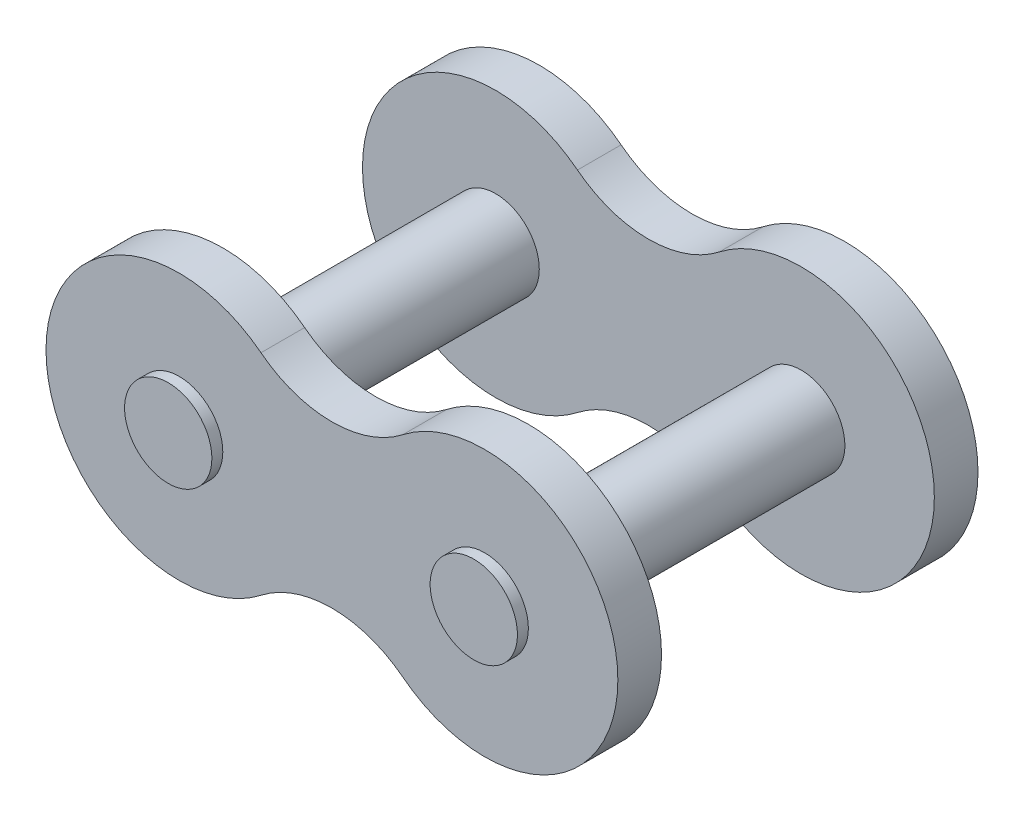
ISO-10303-21;
HEADER;
FILE_DESCRIPTION(('STEP AP214'),'2;1');
FILE_NAME('part.step','',(''),(''),'','','');
FILE_SCHEMA(('AUTOMOTIVE_DESIGN { 1 0 10303 214 1 1 1 1 }'));
ENDSEC;
DATA;
#1=APPLICATION_CONTEXT('core data for automotive mechanical design processes');
#2=APPLICATION_PROTOCOL_DEFINITION('international standard','automotive_design',2000,#1);
#3=PRODUCT_CONTEXT('',#1,'mechanical');
#4=PRODUCT('Part','Part','',(#3));
#5=PRODUCT_RELATED_PRODUCT_CATEGORY('part','',(#4));
#6=PRODUCT_DEFINITION_FORMATION('','',#4);
#7=PRODUCT_DEFINITION_CONTEXT('part definition',#1,'design');
#8=PRODUCT_DEFINITION('design','',#6,#7);
#9=PRODUCT_DEFINITION_SHAPE('','',#8);
#10=(LENGTH_UNIT() NAMED_UNIT(*) SI_UNIT(.MILLI.,.METRE.));
#11=(NAMED_UNIT(*) PLANE_ANGLE_UNIT() SI_UNIT($,.RADIAN.));
#12=(NAMED_UNIT(*) SI_UNIT($,.STERADIAN.) SOLID_ANGLE_UNIT());
#13=UNCERTAINTY_MEASURE_WITH_UNIT(LENGTH_MEASURE(1.E-05),#10,'distance_accuracy_value','');
#14=(GEOMETRIC_REPRESENTATION_CONTEXT(3) GLOBAL_UNCERTAINTY_ASSIGNED_CONTEXT((#13)) GLOBAL_UNIT_ASSIGNED_CONTEXT((#10,
#11,#12)) REPRESENTATION_CONTEXT('',''));
#15=CARTESIAN_POINT('',(0.,0.,0.));
#16=DIRECTION('',(0.,0.,1.));
#17=DIRECTION('',(1.,0.,0.));
#18=AXIS2_PLACEMENT_3D('',#15,#16,#17);
#19=CARTESIAN_POINT('',(3.5,4.4912973174237,2.));
#20=DIRECTION('',(0.,0.,1.));
#21=DIRECTION('',(1.,0.,0.));
#22=AXIS2_PLACEMENT_3D('',#19,#20,#21);
#23=PLANE('',#22);
#24=CARTESIAN_POINT('',(-7.,0.,2.));
#25=DIRECTION('',(0.,0.,1.));
#26=DIRECTION('',(1.,0.,0.));
#27=AXIS2_PLACEMENT_3D('',#24,#25,#26);
#28=CIRCLE('',#27,2.);
#29=CARTESIAN_POINT('',(-5.,0.,2.));
#30=VERTEX_POINT('',#29);
#31=EDGE_CURVE('E174',#30,#30,#28,.T.);
#32=ORIENTED_EDGE('',*,*,#31,.F.);
#33=EDGE_LOOP('',(#32));
#34=FACE_BOUND('',#33,.T.);
#35=CARTESIAN_POINT('',(0.,8.98259463484738,2.));
#36=DIRECTION('',(0.,0.,-1.));
#37=DIRECTION('',(1.,0.,0.));
#38=AXIS2_PLACEMENT_3D('',#35,#36,#37);
#39=CIRCLE('',#38,5.28802030091223);
#40=CARTESIAN_POINT('',(3.25044574283209,4.81153227907224,2.));
#41=VERTEX_POINT('',#40);
#42=CARTESIAN_POINT('',(-3.25044574283209,4.81153227907223,2.));
#43=VERTEX_POINT('',#42);
#44=EDGE_CURVE('E178',#41,#43,#39,.T.);
#45=ORIENTED_EDGE('',*,*,#44,.T.);
#46=CARTESIAN_POINT('',(-7.,0.,2.));
#47=DIRECTION('',(0.,0.,1.));
#48=DIRECTION('',(1.,0.,0.));
#49=AXIS2_PLACEMENT_3D('',#46,#47,#48);
#50=CIRCLE('',#49,6.1);
#51=CARTESIAN_POINT('',(-3.2504457428321,-4.81153227907223,2.));
#52=VERTEX_POINT('',#51);
#53=EDGE_CURVE('E82',#43,#52,#50,.T.);
#54=ORIENTED_EDGE('',*,*,#53,.T.);
#55=CARTESIAN_POINT('',(0.,-8.98259463484738,2.));
#56=DIRECTION('',(0.,0.,-1.));
#57=DIRECTION('',(-1.,0.,0.));
#58=AXIS2_PLACEMENT_3D('',#55,#56,#57);
#59=CIRCLE('',#58,5.28802030091223);
#60=CARTESIAN_POINT('',(3.25044574283208,-4.81153227907223,2.));
#61=VERTEX_POINT('',#60);
#62=EDGE_CURVE('E181',#52,#61,#59,.T.);
#63=ORIENTED_EDGE('',*,*,#62,.T.);
#64=CARTESIAN_POINT('',(7.,0.,2.));
#65=DIRECTION('',(0.,0.,1.));
#66=DIRECTION('',(-1.,0.,0.));
#67=AXIS2_PLACEMENT_3D('',#64,#65,#66);
#68=CIRCLE('',#67,6.1);
#69=EDGE_CURVE('E50',#61,#41,#68,.T.);
#70=ORIENTED_EDGE('',*,*,#69,.T.);
#71=EDGE_LOOP('',(#45,#54,#63,#70));
#72=FACE_BOUND('',#71,.T.);
#73=CARTESIAN_POINT('',(7.,0.,2.));
#74=DIRECTION('',(0.,0.,1.));
#75=DIRECTION('',(-1.,0.,0.));
#76=AXIS2_PLACEMENT_3D('',#73,#74,#75);
#77=CIRCLE('',#76,2.);
#78=CARTESIAN_POINT('',(5.,0.,2.));
#79=VERTEX_POINT('',#78);
#80=EDGE_CURVE('E171',#79,#79,#77,.T.);
#81=ORIENTED_EDGE('',*,*,#80,.F.);
#82=EDGE_LOOP('',(#81));
#83=FACE_BOUND('',#82,.T.);
#84=ADVANCED_FACE('F33',(#34,#72,#83),#23,.T.);
#85=CARTESIAN_POINT('',(3.5,4.4912973174237,0.));
#86=DIRECTION('',(0.,0.,1.));
#87=DIRECTION('',(1.,0.,0.));
#88=AXIS2_PLACEMENT_3D('',#85,#86,#87);
#89=PLANE('',#88);
#90=CARTESIAN_POINT('',(0.,8.98259463484738,0.));
#91=DIRECTION('',(0.,0.,-1.));
#92=DIRECTION('',(1.,0.,0.));
#93=AXIS2_PLACEMENT_3D('',#90,#91,#92);
#94=CIRCLE('',#93,5.28802030091223);
#95=CARTESIAN_POINT('',(3.25044574283209,4.81153227907224,0.));
#96=VERTEX_POINT('',#95);
#97=CARTESIAN_POINT('',(-3.25044574283209,4.81153227907223,0.));
#98=VERTEX_POINT('',#97);
#99=EDGE_CURVE('E177',#96,#98,#94,.T.);
#100=ORIENTED_EDGE('',*,*,#99,.F.);
#101=CARTESIAN_POINT('',(7.,0.,0.));
#102=DIRECTION('',(0.,0.,1.));
#103=DIRECTION('',(-1.,0.,0.));
#104=AXIS2_PLACEMENT_3D('',#101,#102,#103);
#105=CIRCLE('',#104,6.1);
#106=CARTESIAN_POINT('',(3.25044574283208,-4.81153227907223,0.));
#107=VERTEX_POINT('',#106);
#108=EDGE_CURVE('E74',#107,#96,#105,.T.);
#109=ORIENTED_EDGE('',*,*,#108,.F.);
#110=CARTESIAN_POINT('',(0.,-8.98259463484738,0.));
#111=DIRECTION('',(0.,0.,-1.));
#112=DIRECTION('',(-1.,0.,0.));
#113=AXIS2_PLACEMENT_3D('',#110,#111,#112);
#114=CIRCLE('',#113,5.28802030091223);
#115=CARTESIAN_POINT('',(-3.2504457428321,-4.81153227907223,0.));
#116=VERTEX_POINT('',#115);
#117=EDGE_CURVE('E68',#116,#107,#114,.T.);
#118=ORIENTED_EDGE('',*,*,#117,.F.);
#119=CARTESIAN_POINT('',(-7.,0.,0.));
#120=DIRECTION('',(0.,0.,1.));
#121=DIRECTION('',(1.,0.,0.));
#122=AXIS2_PLACEMENT_3D('',#119,#120,#121);
#123=CIRCLE('',#122,6.1);
#124=EDGE_CURVE('E187',#98,#116,#123,.T.);
#125=ORIENTED_EDGE('',*,*,#124,.F.);
#126=EDGE_LOOP('',(#100,#109,#118,#125));
#127=FACE_BOUND('',#126,.T.);
#128=CARTESIAN_POINT('',(-7.,0.,0.));
#129=DIRECTION('',(0.,0.,1.));
#130=DIRECTION('',(1.,0.,0.));
#131=AXIS2_PLACEMENT_3D('',#128,#129,#130);
#132=CIRCLE('',#131,2.);
#133=CARTESIAN_POINT('',(-5.,0.,0.));
#134=VERTEX_POINT('',#133);
#135=EDGE_CURVE('E168',#134,#134,#132,.T.);
#136=ORIENTED_EDGE('',*,*,#135,.T.);
#137=EDGE_LOOP('',(#136));
#138=FACE_BOUND('',#137,.T.);
#139=CARTESIAN_POINT('',(7.,0.,0.));
#140=DIRECTION('',(0.,0.,1.));
#141=DIRECTION('',(1.,0.,0.));
#142=AXIS2_PLACEMENT_3D('',#139,#140,#141);
#143=CIRCLE('',#142,2.);
#144=CARTESIAN_POINT('',(9.,0.,0.));
#145=VERTEX_POINT('',#144);
#146=EDGE_CURVE('E159',#145,#145,#143,.T.);
#147=ORIENTED_EDGE('',*,*,#146,.T.);
#148=EDGE_LOOP('',(#147));
#149=FACE_BOUND('',#148,.T.);
#150=ADVANCED_FACE('F211',(#127,#138,#149),#89,.F.);
#151=CARTESIAN_POINT('',(0.,8.98259463484738,2.));
#152=DIRECTION('',(0.,0.,-1.));
#153=DIRECTION('',(-1.,0.,0.));
#154=AXIS2_PLACEMENT_3D('',#151,#152,#153);
#155=CYLINDRICAL_SURFACE('',#154,5.28802030091223);
#156=ORIENTED_EDGE('',*,*,#99,.T.);
#157=DIRECTION('',(0.,0.,-1.));
#158=VECTOR('',#157,1.);
#159=CARTESIAN_POINT('',(-3.25044574283209,4.81153227907223,2.));
#160=LINE('',#159,#158);
#161=EDGE_CURVE('E196',#43,#98,#160,.T.);
#162=ORIENTED_EDGE('',*,*,#161,.F.);
#163=ORIENTED_EDGE('',*,*,#44,.F.);
#164=DIRECTION('',(0.,0.,-1.));
#165=VECTOR('',#164,1.);
#166=CARTESIAN_POINT('',(3.25044574283209,4.81153227907224,2.));
#167=LINE('',#166,#165);
#168=EDGE_CURVE('E184',#41,#96,#167,.T.);
#169=ORIENTED_EDGE('',*,*,#168,.T.);
#170=EDGE_LOOP('',(#156,#162,#163,#169));
#171=FACE_BOUND('',#170,.T.);
#172=ADVANCED_FACE('F35',(#171),#155,.F.);
#173=CARTESIAN_POINT('',(-7.,0.,2.));
#174=DIRECTION('',(0.,0.,-1.));
#175=DIRECTION('',(-1.,0.,0.));
#176=AXIS2_PLACEMENT_3D('',#173,#174,#175);
#177=CYLINDRICAL_SURFACE('',#176,6.1);
#178=ORIENTED_EDGE('',*,*,#124,.T.);
#179=DIRECTION('',(0.,0.,-1.));
#180=VECTOR('',#179,1.);
#181=CARTESIAN_POINT('',(-3.2504457428321,-4.81153227907223,2.));
#182=LINE('',#181,#180);
#183=EDGE_CURVE('E194',#52,#116,#182,.T.);
#184=ORIENTED_EDGE('',*,*,#183,.F.);
#185=ORIENTED_EDGE('',*,*,#53,.F.);
#186=ORIENTED_EDGE('',*,*,#161,.T.);
#187=EDGE_LOOP('',(#178,#184,#185,#186));
#188=FACE_BOUND('',#187,.T.);
#189=ADVANCED_FACE('F230',(#188),#177,.T.);
#190=CARTESIAN_POINT('',(0.,-8.98259463484738,2.));
#191=DIRECTION('',(0.,0.,-1.));
#192=DIRECTION('',(-1.,0.,0.));
#193=AXIS2_PLACEMENT_3D('',#190,#191,#192);
#194=CYLINDRICAL_SURFACE('',#193,5.28802030091223);
#195=ORIENTED_EDGE('',*,*,#117,.T.);
#196=DIRECTION('',(0.,0.,-1.));
#197=VECTOR('',#196,1.);
#198=CARTESIAN_POINT('',(3.25044574283208,-4.81153227907223,2.));
#199=LINE('',#198,#197);
#200=EDGE_CURVE('E192',#61,#107,#199,.T.);
#201=ORIENTED_EDGE('',*,*,#200,.F.);
#202=ORIENTED_EDGE('',*,*,#62,.F.);
#203=ORIENTED_EDGE('',*,*,#183,.T.);
#204=EDGE_LOOP('',(#195,#201,#202,#203));
#205=FACE_BOUND('',#204,.T.);
#206=ADVANCED_FACE('F228',(#205),#194,.F.);
#207=CARTESIAN_POINT('',(7.,0.,2.));
#208=DIRECTION('',(0.,0.,-1.));
#209=DIRECTION('',(-1.,0.,0.));
#210=AXIS2_PLACEMENT_3D('',#207,#208,#209);
#211=CYLINDRICAL_SURFACE('',#210,6.1);
#212=ORIENTED_EDGE('',*,*,#108,.T.);
#213=ORIENTED_EDGE('',*,*,#168,.F.);
#214=ORIENTED_EDGE('',*,*,#69,.F.);
#215=ORIENTED_EDGE('',*,*,#200,.T.);
#216=EDGE_LOOP('',(#212,#213,#214,#215));
#217=FACE_BOUND('',#216,.T.);
#218=ADVANCED_FACE('F224',(#217),#211,.T.);
#219=CARTESIAN_POINT('',(-7.,0.,-0.5));
#220=DIRECTION('',(0.,0.,1.));
#221=DIRECTION('',(1.,0.,0.));
#222=AXIS2_PLACEMENT_3D('',#219,#220,#221);
#223=PLANE('',#222);
#224=CARTESIAN_POINT('',(-7.,0.,-0.5));
#225=DIRECTION('',(0.,0.,1.));
#226=DIRECTION('',(1.,0.,0.));
#227=AXIS2_PLACEMENT_3D('',#224,#225,#226);
#228=CIRCLE('',#227,2.);
#229=CARTESIAN_POINT('',(-5.,0.,-0.5));
#230=VERTEX_POINT('',#229);
#231=EDGE_CURVE('E165',#230,#230,#228,.T.);
#232=ORIENTED_EDGE('',*,*,#231,.F.);
#233=EDGE_LOOP('',(#232));
#234=FACE_BOUND('',#233,.T.);
#235=ADVANCED_FACE('F227',(#234),#223,.F.);
#236=CARTESIAN_POINT('',(-7.,0.,-0.5));
#237=DIRECTION('',(0.,0.,1.));
#238=DIRECTION('',(1.,0.,0.));
#239=AXIS2_PLACEMENT_3D('',#236,#237,#238);
#240=CYLINDRICAL_SURFACE('',#239,2.);
#241=ORIENTED_EDGE('',*,*,#231,.T.);
#242=EDGE_LOOP('',(#241));
#243=FACE_BOUND('',#242,.T.);
#244=ORIENTED_EDGE('',*,*,#135,.F.);
#245=EDGE_LOOP('',(#244));
#246=FACE_BOUND('',#245,.T.);
#247=ADVANCED_FACE('F336',(#243,#246),#240,.T.);
#248=CARTESIAN_POINT('',(-7.,0.,14.5));
#249=DIRECTION('',(0.,0.,-1.));
#250=DIRECTION('',(-1.,0.,0.));
#251=AXIS2_PLACEMENT_3D('',#248,#249,#250);
#252=CIRCLE('',#251,2.);
#253=CARTESIAN_POINT('',(-9.,0.,14.5));
#254=VERTEX_POINT('',#253);
#255=EDGE_CURVE('E11',#254,#254,#252,.F.);
#256=ORIENTED_EDGE('',*,*,#255,.F.);
#257=EDGE_LOOP('',(#256));
#258=FACE_BOUND('',#257,.T.);
#259=ORIENTED_EDGE('',*,*,#31,.T.);
#260=EDGE_LOOP('',(#259));
#261=FACE_BOUND('',#260,.T.);
#262=ADVANCED_FACE('F221',(#258,#261),#240,.T.);
#263=CARTESIAN_POINT('',(7.,0.,-0.5));
#264=DIRECTION('',(0.,0.,1.));
#265=DIRECTION('',(1.,0.,0.));
#266=AXIS2_PLACEMENT_3D('',#263,#264,#265);
#267=PLANE('',#266);
#268=CARTESIAN_POINT('',(7.,0.,-0.5));
#269=DIRECTION('',(0.,0.,1.));
#270=DIRECTION('',(1.,0.,0.));
#271=AXIS2_PLACEMENT_3D('',#268,#269,#270);
#272=CIRCLE('',#271,2.);
#273=CARTESIAN_POINT('',(9.,0.,-0.5));
#274=VERTEX_POINT('',#273);
#275=EDGE_CURVE('E120',#274,#274,#272,.T.);
#276=ORIENTED_EDGE('',*,*,#275,.F.);
#277=EDGE_LOOP('',(#276));
#278=FACE_BOUND('',#277,.T.);
#279=ADVANCED_FACE('F246',(#278),#267,.F.);
#280=CARTESIAN_POINT('',(7.,0.,-0.5));
#281=DIRECTION('',(0.,0.,1.));
#282=DIRECTION('',(1.,0.,0.));
#283=AXIS2_PLACEMENT_3D('',#280,#281,#282);
#284=CYLINDRICAL_SURFACE('',#283,2.);
#285=ORIENTED_EDGE('',*,*,#275,.T.);
#286=EDGE_LOOP('',(#285));
#287=FACE_BOUND('',#286,.T.);
#288=ORIENTED_EDGE('',*,*,#146,.F.);
#289=EDGE_LOOP('',(#288));
#290=FACE_BOUND('',#289,.T.);
#291=ADVANCED_FACE('F205',(#287,#290),#284,.T.);
#292=CARTESIAN_POINT('',(7.,0.,14.5));
#293=DIRECTION('',(0.,0.,-1.));
#294=DIRECTION('',(-1.,0.,0.));
#295=AXIS2_PLACEMENT_3D('',#292,#293,#294);
#296=CIRCLE('',#295,2.);
#297=CARTESIAN_POINT('',(5.,0.,14.5));
#298=VERTEX_POINT('',#297);
#299=EDGE_CURVE('E42',#298,#298,#296,.F.);
#300=ORIENTED_EDGE('',*,*,#299,.F.);
#301=EDGE_LOOP('',(#300));
#302=FACE_BOUND('',#301,.T.);
#303=ORIENTED_EDGE('',*,*,#80,.T.);
#304=EDGE_LOOP('',(#303));
#305=FACE_BOUND('',#304,.T.);
#306=ADVANCED_FACE('F202',(#302,#305),#284,.T.);
#307=CARTESIAN_POINT('',(0.,8.98259463484738,14.5));
#308=DIRECTION('',(0.,0.,1.));
#309=DIRECTION('',(1.,0.,0.));
#310=AXIS2_PLACEMENT_3D('',#307,#308,#309);
#311=CYLINDRICAL_SURFACE('',#310,5.28802030091223);
#312=CARTESIAN_POINT('',(0.,8.98259463484738,16.5));
#313=DIRECTION('',(0.,0.,-1.));
#314=DIRECTION('',(1.,0.,0.));
#315=AXIS2_PLACEMENT_3D('',#312,#313,#314);
#316=CIRCLE('',#315,5.28802030091223);
#317=CARTESIAN_POINT('',(3.25044574283209,4.81153227907224,16.5));
#318=VERTEX_POINT('',#317);
#319=CARTESIAN_POINT('',(-3.25044574283209,4.81153227907223,16.5));
#320=VERTEX_POINT('',#319);
#321=EDGE_CURVE('E115',#318,#320,#316,.T.);
#322=ORIENTED_EDGE('',*,*,#321,.F.);
#323=DIRECTION('',(0.,0.,1.));
#324=VECTOR('',#323,1.);
#325=CARTESIAN_POINT('',(3.25044574283209,4.81153227907224,14.5));
#326=LINE('',#325,#324);
#327=CARTESIAN_POINT('',(3.25044574283209,4.81153227907224,14.5));
#328=VERTEX_POINT('',#327);
#329=EDGE_CURVE('E109',#328,#318,#326,.T.);
#330=ORIENTED_EDGE('',*,*,#329,.F.);
#331=CARTESIAN_POINT('',(0.,8.98259463484738,14.5));
#332=DIRECTION('',(0.,0.,-1.));
#333=DIRECTION('',(1.,0.,0.));
#334=AXIS2_PLACEMENT_3D('',#331,#332,#333);
#335=CIRCLE('',#334,5.28802030091223);
#336=CARTESIAN_POINT('',(-3.25044574283209,4.81153227907223,14.5));
#337=VERTEX_POINT('',#336);
#338=EDGE_CURVE('E112',#328,#337,#335,.T.);
#339=ORIENTED_EDGE('',*,*,#338,.T.);
#340=DIRECTION('',(0.,0.,1.));
#341=VECTOR('',#340,1.);
#342=CARTESIAN_POINT('',(-3.25044574283209,4.81153227907223,14.5));
#343=LINE('',#342,#341);
#344=EDGE_CURVE('E140',#337,#320,#343,.T.);
#345=ORIENTED_EDGE('',*,*,#344,.T.);
#346=EDGE_LOOP('',(#322,#330,#339,#345));
#347=FACE_BOUND('',#346,.T.);
#348=ADVANCED_FACE('F111',(#347),#311,.F.);
#349=CARTESIAN_POINT('',(7.,0.,14.5));
#350=DIRECTION('',(0.,0.,1.));
#351=DIRECTION('',(1.,0.,0.));
#352=AXIS2_PLACEMENT_3D('',#349,#350,#351);
#353=CYLINDRICAL_SURFACE('',#352,6.1);
#354=CARTESIAN_POINT('',(7.,0.,16.5));
#355=DIRECTION('',(0.,0.,1.));
#356=DIRECTION('',(-1.,0.,0.));
#357=AXIS2_PLACEMENT_3D('',#354,#355,#356);
#358=CIRCLE('',#357,6.1);
#359=CARTESIAN_POINT('',(3.25044574283208,-4.81153227907223,16.5));
#360=VERTEX_POINT('',#359);
#361=EDGE_CURVE('E142',#360,#318,#358,.T.);
#362=ORIENTED_EDGE('',*,*,#361,.F.);
#363=DIRECTION('',(0.,0.,1.));
#364=VECTOR('',#363,1.);
#365=CARTESIAN_POINT('',(3.25044574283208,-4.81153227907223,14.5));
#366=LINE('',#365,#364);
#367=CARTESIAN_POINT('',(3.25044574283208,-4.81153227907223,14.5));
#368=VERTEX_POINT('',#367);
#369=EDGE_CURVE('E121',#368,#360,#366,.T.);
#370=ORIENTED_EDGE('',*,*,#369,.F.);
#371=CARTESIAN_POINT('',(7.,0.,14.5));
#372=DIRECTION('',(0.,0.,1.));
#373=DIRECTION('',(-1.,0.,0.));
#374=AXIS2_PLACEMENT_3D('',#371,#372,#373);
#375=CIRCLE('',#374,6.1);
#376=EDGE_CURVE('E127',#368,#328,#375,.T.);
#377=ORIENTED_EDGE('',*,*,#376,.T.);
#378=ORIENTED_EDGE('',*,*,#329,.T.);
#379=EDGE_LOOP('',(#362,#370,#377,#378));
#380=FACE_BOUND('',#379,.T.);
#381=ADVANCED_FACE('F133',(#380),#353,.T.);
#382=CARTESIAN_POINT('',(0.,-8.98259463484738,14.5));
#383=DIRECTION('',(0.,0.,1.));
#384=DIRECTION('',(1.,0.,0.));
#385=AXIS2_PLACEMENT_3D('',#382,#383,#384);
#386=CYLINDRICAL_SURFACE('',#385,5.28802030091223);
#387=CARTESIAN_POINT('',(0.,-8.98259463484738,16.5));
#388=DIRECTION('',(0.,0.,-1.));
#389=DIRECTION('',(-1.,0.,0.));
#390=AXIS2_PLACEMENT_3D('',#387,#388,#389);
#391=CIRCLE('',#390,5.28802030091223);
#392=CARTESIAN_POINT('',(-3.2504457428321,-4.81153227907223,16.5));
#393=VERTEX_POINT('',#392);
#394=EDGE_CURVE('E145',#393,#360,#391,.T.);
#395=ORIENTED_EDGE('',*,*,#394,.F.);
#396=DIRECTION('',(0.,0.,1.));
#397=VECTOR('',#396,1.);
#398=CARTESIAN_POINT('',(-3.2504457428321,-4.81153227907223,14.5));
#399=LINE('',#398,#397);
#400=CARTESIAN_POINT('',(-3.2504457428321,-4.81153227907223,14.5));
#401=VERTEX_POINT('',#400);
#402=EDGE_CURVE('E151',#401,#393,#399,.T.);
#403=ORIENTED_EDGE('',*,*,#402,.F.);
#404=CARTESIAN_POINT('',(0.,-8.98259463484738,14.5));
#405=DIRECTION('',(0.,0.,-1.));
#406=DIRECTION('',(-1.,0.,0.));
#407=AXIS2_PLACEMENT_3D('',#404,#405,#406);
#408=CIRCLE('',#407,5.28802030091223);
#409=EDGE_CURVE('E134',#401,#368,#408,.T.);
#410=ORIENTED_EDGE('',*,*,#409,.T.);
#411=ORIENTED_EDGE('',*,*,#369,.T.);
#412=EDGE_LOOP('',(#395,#403,#410,#411));
#413=FACE_BOUND('',#412,.T.);
#414=ADVANCED_FACE('F284',(#413),#386,.F.);
#415=CARTESIAN_POINT('',(-7.,0.,14.5));
#416=DIRECTION('',(0.,0.,1.));
#417=DIRECTION('',(1.,0.,0.));
#418=AXIS2_PLACEMENT_3D('',#415,#416,#417);
#419=CYLINDRICAL_SURFACE('',#418,6.1);
#420=CARTESIAN_POINT('',(-7.,0.,16.5));
#421=DIRECTION('',(0.,0.,1.));
#422=DIRECTION('',(1.,0.,0.));
#423=AXIS2_PLACEMENT_3D('',#420,#421,#422);
#424=CIRCLE('',#423,6.1);
#425=EDGE_CURVE('E131',#320,#393,#424,.T.);
#426=ORIENTED_EDGE('',*,*,#425,.F.);
#427=ORIENTED_EDGE('',*,*,#344,.F.);
#428=CARTESIAN_POINT('',(-7.,0.,14.5));
#429=DIRECTION('',(0.,0.,1.));
#430=DIRECTION('',(1.,0.,0.));
#431=AXIS2_PLACEMENT_3D('',#428,#429,#430);
#432=CIRCLE('',#431,6.1);
#433=EDGE_CURVE('E130',#337,#401,#432,.T.);
#434=ORIENTED_EDGE('',*,*,#433,.T.);
#435=ORIENTED_EDGE('',*,*,#402,.T.);
#436=EDGE_LOOP('',(#426,#427,#434,#435));
#437=FACE_BOUND('',#436,.T.);
#438=ADVANCED_FACE('F281',(#437),#419,.T.);
#439=CARTESIAN_POINT('',(3.5,4.4912973174237,14.5));
#440=DIRECTION('',(0.,0.,-1.));
#441=DIRECTION('',(1.,0.,0.));
#442=AXIS2_PLACEMENT_3D('',#439,#440,#441);
#443=PLANE('',#442);
#444=ORIENTED_EDGE('',*,*,#299,.T.);
#445=EDGE_LOOP('',(#444));
#446=FACE_BOUND('',#445,.T.);
#447=ORIENTED_EDGE('',*,*,#255,.T.);
#448=EDGE_LOOP('',(#447));
#449=FACE_BOUND('',#448,.T.);
#450=ORIENTED_EDGE('',*,*,#338,.F.);
#451=ORIENTED_EDGE('',*,*,#376,.F.);
#452=ORIENTED_EDGE('',*,*,#409,.F.);
#453=ORIENTED_EDGE('',*,*,#433,.F.);
#454=EDGE_LOOP('',(#450,#451,#452,#453));
#455=FACE_BOUND('',#454,.T.);
#456=ADVANCED_FACE('F125',(#446,#449,#455),#443,.T.);
#457=CARTESIAN_POINT('',(3.5,4.4912973174237,16.5));
#458=DIRECTION('',(0.,0.,-1.));
#459=DIRECTION('',(1.,0.,0.));
#460=AXIS2_PLACEMENT_3D('',#457,#458,#459);
#461=PLANE('',#460);
#462=CARTESIAN_POINT('',(7.,0.,16.5));
#463=DIRECTION('',(0.,0.,1.));
#464=DIRECTION('',(-1.,0.,0.));
#465=AXIS2_PLACEMENT_3D('',#462,#463,#464);
#466=CIRCLE('',#465,2.);
#467=CARTESIAN_POINT('',(5.,0.,16.5));
#468=VERTEX_POINT('',#467);
#469=EDGE_CURVE('E267',#468,#468,#466,.T.);
#470=ORIENTED_EDGE('',*,*,#469,.F.);
#471=EDGE_LOOP('',(#470));
#472=FACE_BOUND('',#471,.T.);
#473=CARTESIAN_POINT('',(-7.,0.,16.5));
#474=DIRECTION('',(0.,0.,1.));
#475=DIRECTION('',(1.,0.,0.));
#476=AXIS2_PLACEMENT_3D('',#473,#474,#475);
#477=CIRCLE('',#476,2.);
#478=CARTESIAN_POINT('',(-5.,0.,16.5));
#479=VERTEX_POINT('',#478);
#480=EDGE_CURVE('E143',#479,#479,#477,.T.);
#481=ORIENTED_EDGE('',*,*,#480,.F.);
#482=EDGE_LOOP('',(#481));
#483=FACE_BOUND('',#482,.T.);
#484=ORIENTED_EDGE('',*,*,#321,.T.);
#485=ORIENTED_EDGE('',*,*,#425,.T.);
#486=ORIENTED_EDGE('',*,*,#394,.T.);
#487=ORIENTED_EDGE('',*,*,#361,.T.);
#488=EDGE_LOOP('',(#484,#485,#486,#487));
#489=FACE_BOUND('',#488,.T.);
#490=ADVANCED_FACE('F274',(#472,#483,#489),#461,.F.);
#491=CARTESIAN_POINT('',(-7.,0.,17.));
#492=DIRECTION('',(0.,0.,1.));
#493=DIRECTION('',(1.,0.,0.));
#494=AXIS2_PLACEMENT_3D('',#491,#492,#493);
#495=PLANE('',#494);
#496=CARTESIAN_POINT('',(-7.,0.,17.));
#497=DIRECTION('',(0.,0.,1.));
#498=DIRECTION('',(1.,0.,0.));
#499=AXIS2_PLACEMENT_3D('',#496,#497,#498);
#500=CIRCLE('',#499,2.);
#501=CARTESIAN_POINT('',(-5.,0.,17.));
#502=VERTEX_POINT('',#501);
#503=EDGE_CURVE('E162',#502,#502,#500,.T.);
#504=ORIENTED_EDGE('',*,*,#503,.T.);
#505=EDGE_LOOP('',(#504));
#506=FACE_BOUND('',#505,.T.);
#507=ADVANCED_FACE('F277',(#506),#495,.T.);
#508=ORIENTED_EDGE('',*,*,#503,.F.);
#509=EDGE_LOOP('',(#508));
#510=FACE_BOUND('',#509,.T.);
#511=ORIENTED_EDGE('',*,*,#480,.T.);
#512=EDGE_LOOP('',(#511));
#513=FACE_BOUND('',#512,.T.);
#514=ADVANCED_FACE('F260',(#510,#513),#240,.T.);
#515=CARTESIAN_POINT('',(7.,0.,17.));
#516=DIRECTION('',(0.,0.,1.));
#517=DIRECTION('',(1.,0.,0.));
#518=AXIS2_PLACEMENT_3D('',#515,#516,#517);
#519=PLANE('',#518);
#520=CARTESIAN_POINT('',(7.,0.,17.));
#521=DIRECTION('',(0.,0.,1.));
#522=DIRECTION('',(1.,0.,0.));
#523=AXIS2_PLACEMENT_3D('',#520,#521,#522);
#524=CIRCLE('',#523,2.);
#525=CARTESIAN_POINT('',(9.,0.,17.));
#526=VERTEX_POINT('',#525);
#527=EDGE_CURVE('E156',#526,#526,#524,.T.);
#528=ORIENTED_EDGE('',*,*,#527,.T.);
#529=EDGE_LOOP('',(#528));
#530=FACE_BOUND('',#529,.T.);
#531=ADVANCED_FACE('F255',(#530),#519,.T.);
#532=ORIENTED_EDGE('',*,*,#527,.F.);
#533=EDGE_LOOP('',(#532));
#534=FACE_BOUND('',#533,.T.);
#535=ORIENTED_EDGE('',*,*,#469,.T.);
#536=EDGE_LOOP('',(#535));
#537=FACE_BOUND('',#536,.T.);
#538=ADVANCED_FACE('F207',(#534,#537),#284,.T.);
#539=CLOSED_SHELL('',(#84,#150,#172,#189,#206,#218,#235,#247,#262,#279,#291,#306,#348,#381,#414,
#438,#456,#490,#507,#514,#531,#538));
#540=MANIFOLD_SOLID_BREP('B2',#539);
#541=ADVANCED_BREP_SHAPE_REPRESENTATION('',(#18,#540),#14);
#542=SHAPE_DEFINITION_REPRESENTATION(#9,#541);
ENDSEC;
END-ISO-10303-21;
